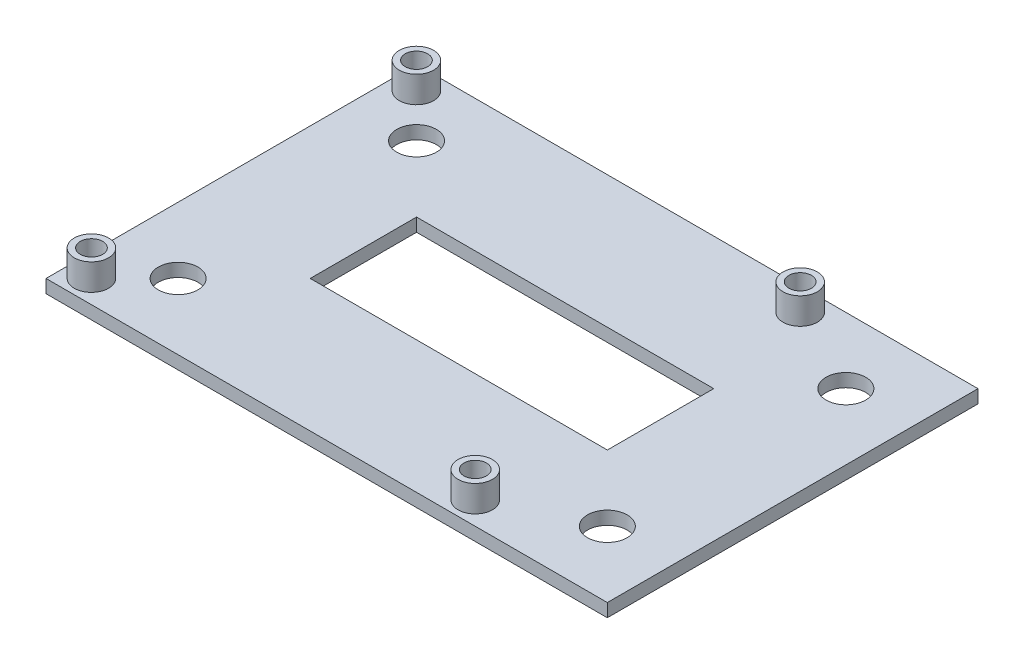
ISO-10303-21;
HEADER;
FILE_DESCRIPTION(('STEP AP214'),'2;1');
FILE_NAME('part.step','',(''),(''),'','','');
FILE_SCHEMA(('AUTOMOTIVE_DESIGN { 1 0 10303 214 1 1 1 1 }'));
ENDSEC;
DATA;
#1=APPLICATION_CONTEXT('core data for automotive mechanical design processes');
#2=APPLICATION_PROTOCOL_DEFINITION('international standard','automotive_design',2000,#1);
#3=PRODUCT_CONTEXT('',#1,'mechanical');
#4=PRODUCT('Part','Part','',(#3));
#5=PRODUCT_RELATED_PRODUCT_CATEGORY('part','',(#4));
#6=PRODUCT_DEFINITION_FORMATION('','',#4);
#7=PRODUCT_DEFINITION_CONTEXT('part definition',#1,'design');
#8=PRODUCT_DEFINITION('design','',#6,#7);
#9=PRODUCT_DEFINITION_SHAPE('','',#8);
#10=(LENGTH_UNIT() NAMED_UNIT(*) SI_UNIT(.MILLI.,.METRE.));
#11=(NAMED_UNIT(*) PLANE_ANGLE_UNIT() SI_UNIT($,.RADIAN.));
#12=(NAMED_UNIT(*) SI_UNIT($,.STERADIAN.) SOLID_ANGLE_UNIT());
#13=UNCERTAINTY_MEASURE_WITH_UNIT(LENGTH_MEASURE(1.E-05),#10,'distance_accuracy_value','');
#14=(GEOMETRIC_REPRESENTATION_CONTEXT(3) GLOBAL_UNCERTAINTY_ASSIGNED_CONTEXT((#13)) GLOBAL_UNIT_ASSIGNED_CONTEXT((#10,
#11,#12)) REPRESENTATION_CONTEXT('',''));
#15=CARTESIAN_POINT('',(0.,0.,0.));
#16=DIRECTION('',(0.,0.,1.));
#17=DIRECTION('',(1.,0.,0.));
#18=AXIS2_PLACEMENT_3D('',#15,#16,#17);
#19=CARTESIAN_POINT('',(0.,2.,0.));
#20=DIRECTION('',(0.,1.,0.));
#21=DIRECTION('',(0.,0.,1.));
#22=AXIS2_PLACEMENT_3D('',#19,#20,#21);
#23=PLANE('',#22);
#24=CARTESIAN_POINT('',(47.6596560099016,2.,28.9234549589851));
#25=DIRECTION('',(0.,1.,0.));
#26=DIRECTION('',(0.,0.,1.));
#27=AXIS2_PLACEMENT_3D('',#24,#25,#26);
#28=CIRCLE('',#27,2.6);
#29=CARTESIAN_POINT('',(47.6596560099016,2.,31.5234549589851));
#30=VERTEX_POINT('',#29);
#31=EDGE_CURVE('E308',#30,#30,#28,.T.);
#32=ORIENTED_EDGE('',*,*,#31,.F.);
#33=EDGE_LOOP('',(#32));
#34=FACE_BOUND('',#33,.T.);
#35=CARTESIAN_POINT('',(-10.4403439900984,2.,28.9234549589851));
#36=DIRECTION('',(0.,1.,0.));
#37=DIRECTION('',(0.,0.,1.));
#38=AXIS2_PLACEMENT_3D('',#35,#36,#37);
#39=CIRCLE('',#38,2.6);
#40=CARTESIAN_POINT('',(-10.4403439900984,2.,31.5234549589851));
#41=VERTEX_POINT('',#40);
#42=EDGE_CURVE('E314',#41,#41,#39,.T.);
#43=ORIENTED_EDGE('',*,*,#42,.F.);
#44=EDGE_LOOP('',(#43));
#45=FACE_BOUND('',#44,.T.);
#46=CARTESIAN_POINT('',(47.6596560099016,2.,-20.2765450410149));
#47=DIRECTION('',(0.,1.,0.));
#48=DIRECTION('',(0.,0.,1.));
#49=AXIS2_PLACEMENT_3D('',#46,#47,#48);
#50=CIRCLE('',#49,2.6);
#51=CARTESIAN_POINT('',(47.6596560099016,2.,-17.6765450410149));
#52=VERTEX_POINT('',#51);
#53=EDGE_CURVE('E320',#52,#52,#50,.T.);
#54=ORIENTED_EDGE('',*,*,#53,.F.);
#55=EDGE_LOOP('',(#54));
#56=FACE_BOUND('',#55,.T.);
#57=CARTESIAN_POINT('',(-10.4403439900984,2.,-20.2765450410149));
#58=DIRECTION('',(0.,1.,0.));
#59=DIRECTION('',(0.,0.,1.));
#60=AXIS2_PLACEMENT_3D('',#57,#58,#59);
#61=CIRCLE('',#60,2.6);
#62=CARTESIAN_POINT('',(-10.4403439900984,2.,-17.6765450410149));
#63=VERTEX_POINT('',#62);
#64=EDGE_CURVE('E326',#63,#63,#61,.T.);
#65=ORIENTED_EDGE('',*,*,#64,.F.);
#66=EDGE_LOOP('',(#65));
#67=FACE_BOUND('',#66,.T.);
#68=CARTESIAN_POINT('',(61.1246485529559,2.,-13.7265450410149));
#69=DIRECTION('',(0.,1.,0.));
#70=DIRECTION('',(0.,0.,1.));
#71=AXIS2_PLACEMENT_3D('',#68,#69,#70);
#72=CIRCLE('',#71,3.);
#73=CARTESIAN_POINT('',(61.1246485529559,2.,-10.7265450410149));
#74=VERTEX_POINT('',#73);
#75=EDGE_CURVE('E341',#74,#74,#72,.T.);
#76=ORIENTED_EDGE('',*,*,#75,.F.);
#77=EDGE_LOOP('',(#76));
#78=FACE_BOUND('',#77,.T.);
#79=CARTESIAN_POINT('',(-3.87209862491442,2.,-13.7265450410149));
#80=DIRECTION('',(0.,1.,0.));
#81=DIRECTION('',(0.,0.,1.));
#82=AXIS2_PLACEMENT_3D('',#79,#80,#81);
#83=CIRCLE('',#82,3.);
#84=CARTESIAN_POINT('',(-3.87209862491442,2.,-10.7265450410149));
#85=VERTEX_POINT('',#84);
#86=EDGE_CURVE('E127',#85,#85,#83,.T.);
#87=ORIENTED_EDGE('',*,*,#86,.F.);
#88=EDGE_LOOP('',(#87));
#89=FACE_BOUND('',#88,.T.);
#90=DIRECTION('',(1.,0.,0.));
#91=VECTOR('',#90,1.);
#92=CARTESIAN_POINT('',(71.1096560099016,2.,32.3734549589851));
#93=LINE('',#92,#91);
#94=CARTESIAN_POINT('',(-13.8720986249144,2.,32.3734549589851));
#95=VERTEX_POINT('',#94);
#96=CARTESIAN_POINT('',(71.1096560099016,2.,32.3734549589851));
#97=VERTEX_POINT('',#96);
#98=EDGE_CURVE('E137',#95,#97,#93,.T.);
#99=ORIENTED_EDGE('',*,*,#98,.T.);
#100=DIRECTION('',(0.000325229308716985,0.,-0.999999947112947));
#101=VECTOR('',#100,1.);
#102=CARTESIAN_POINT('',(71.1096560099016,2.,32.3734549589851));
#103=LINE('',#102,#101);
#104=CARTESIAN_POINT('',(71.1279013750856,2.,-23.7265450410149));
#105=VERTEX_POINT('',#104);
#106=EDGE_CURVE('E140',#97,#105,#103,.T.);
#107=ORIENTED_EDGE('',*,*,#106,.T.);
#108=DIRECTION('',(-1.,0.,0.));
#109=VECTOR('',#108,1.);
#110=CARTESIAN_POINT('',(-13.8720986249144,2.,-23.7265450410149));
#111=LINE('',#110,#109);
#112=CARTESIAN_POINT('',(-13.8720986249144,2.,-23.7265450410149));
#113=VERTEX_POINT('',#112);
#114=EDGE_CURVE('E143',#105,#113,#111,.T.);
#115=ORIENTED_EDGE('',*,*,#114,.T.);
#116=DIRECTION('',(0.,0.,1.));
#117=VECTOR('',#116,1.);
#118=CARTESIAN_POINT('',(-13.8720986249144,2.,-23.7265450410149));
#119=LINE('',#118,#117);
#120=EDGE_CURVE('E145',#113,#95,#119,.T.);
#121=ORIENTED_EDGE('',*,*,#120,.T.);
#122=EDGE_LOOP('',(#99,#107,#115,#121));
#123=FACE_BOUND('',#122,.T.);
#124=DIRECTION('',(1.,0.,0.));
#125=VECTOR('',#124,1.);
#126=CARTESIAN_POINT('',(51.1161595386789,2.,12.3734549589851));
#127=LINE('',#126,#125);
#128=CARTESIAN_POINT('',(6.12790137508558,2.,12.3734549589851));
#129=VERTEX_POINT('',#128);
#130=CARTESIAN_POINT('',(51.1161595386789,2.,12.3734549589851));
#131=VERTEX_POINT('',#130);
#132=EDGE_CURVE('E106',#129,#131,#127,.T.);
#133=ORIENTED_EDGE('',*,*,#132,.F.);
#134=DIRECTION('',(0.,0.,1.));
#135=VECTOR('',#134,1.);
#136=CARTESIAN_POINT('',(6.12790137508558,2.,-3.72654504101487));
#137=LINE('',#136,#135);
#138=CARTESIAN_POINT('',(6.12790137508558,2.,-3.72654504101487));
#139=VERTEX_POINT('',#138);
#140=EDGE_CURVE('E98',#139,#129,#137,.T.);
#141=ORIENTED_EDGE('',*,*,#140,.F.);
#142=DIRECTION('',(-1.,0.,0.));
#143=VECTOR('',#142,1.);
#144=CARTESIAN_POINT('',(6.12790137508558,2.,-3.72654504101487));
#145=LINE('',#144,#143);
#146=CARTESIAN_POINT('',(51.1213957308261,2.,-3.72654504101487));
#147=VERTEX_POINT('',#146);
#148=EDGE_CURVE('E121',#147,#139,#145,.T.);
#149=ORIENTED_EDGE('',*,*,#148,.F.);
#150=DIRECTION('',(0.000325229308716912,0.,-0.999999947112947));
#151=VECTOR('',#150,1.);
#152=CARTESIAN_POINT('',(51.1161595386789,2.,12.3734549589851));
#153=LINE('',#152,#151);
#154=EDGE_CURVE('E119',#131,#147,#153,.T.);
#155=ORIENTED_EDGE('',*,*,#154,.F.);
#156=EDGE_LOOP('',(#133,#141,#149,#155));
#157=FACE_BOUND('',#156,.T.);
#158=CARTESIAN_POINT('',(-3.87209862491442,2.,22.3734549589851));
#159=DIRECTION('',(0.,1.,0.));
#160=DIRECTION('',(0.,0.,1.));
#161=AXIS2_PLACEMENT_3D('',#158,#159,#160);
#162=CIRCLE('',#161,3.);
#163=CARTESIAN_POINT('',(-3.87209862491442,2.,25.3734549589851));
#164=VERTEX_POINT('',#163);
#165=EDGE_CURVE('E347',#164,#164,#162,.T.);
#166=ORIENTED_EDGE('',*,*,#165,.F.);
#167=EDGE_LOOP('',(#166));
#168=FACE_BOUND('',#167,.T.);
#169=CARTESIAN_POINT('',(61.1129077742902,2.,22.3734549589851));
#170=DIRECTION('',(0.,1.,0.));
#171=DIRECTION('',(0.,0.,1.));
#172=AXIS2_PLACEMENT_3D('',#169,#170,#171);
#173=CIRCLE('',#172,3.);
#174=CARTESIAN_POINT('',(61.1129077742902,2.,25.3734549589851));
#175=VERTEX_POINT('',#174);
#176=EDGE_CURVE('E335',#175,#175,#173,.T.);
#177=ORIENTED_EDGE('',*,*,#176,.F.);
#178=EDGE_LOOP('',(#177));
#179=FACE_BOUND('',#178,.T.);
#180=ADVANCED_FACE('F33',(#34,#45,#56,#67,#78,#89,#123,#157,#168,#179),#23,.T.);
#181=CARTESIAN_POINT('',(0.,0.,0.));
#182=DIRECTION('',(0.,1.,0.));
#183=DIRECTION('',(0.,0.,1.));
#184=AXIS2_PLACEMENT_3D('',#181,#182,#183);
#185=PLANE('',#184);
#186=CARTESIAN_POINT('',(47.6596560099016,0.,28.9234549589851));
#187=DIRECTION('',(0.,1.,0.));
#188=DIRECTION('',(0.,0.,1.));
#189=AXIS2_PLACEMENT_3D('',#186,#187,#188);
#190=CIRCLE('',#189,1.7);
#191=CARTESIAN_POINT('',(47.6596560099016,0.,30.6234549589851));
#192=VERTEX_POINT('',#191);
#193=EDGE_CURVE('E285',#192,#192,#190,.T.);
#194=ORIENTED_EDGE('',*,*,#193,.T.);
#195=EDGE_LOOP('',(#194));
#196=FACE_BOUND('',#195,.T.);
#197=CARTESIAN_POINT('',(47.6596560099016,0.,-20.2765450410149));
#198=DIRECTION('',(0.,1.,0.));
#199=DIRECTION('',(0.,0.,1.));
#200=AXIS2_PLACEMENT_3D('',#197,#198,#199);
#201=CIRCLE('',#200,1.7);
#202=CARTESIAN_POINT('',(47.6596560099016,0.,-18.5765450410149));
#203=VERTEX_POINT('',#202);
#204=EDGE_CURVE('E293',#203,#203,#201,.T.);
#205=ORIENTED_EDGE('',*,*,#204,.T.);
#206=EDGE_LOOP('',(#205));
#207=FACE_BOUND('',#206,.T.);
#208=CARTESIAN_POINT('',(-10.4403439900984,0.,-20.2765450410149));
#209=DIRECTION('',(0.,1.,0.));
#210=DIRECTION('',(0.,0.,1.));
#211=AXIS2_PLACEMENT_3D('',#208,#209,#210);
#212=CIRCLE('',#211,1.7);
#213=CARTESIAN_POINT('',(-10.4403439900984,0.,-18.5765450410149));
#214=VERTEX_POINT('',#213);
#215=EDGE_CURVE('E299',#214,#214,#212,.T.);
#216=ORIENTED_EDGE('',*,*,#215,.T.);
#217=EDGE_LOOP('',(#216));
#218=FACE_BOUND('',#217,.T.);
#219=CARTESIAN_POINT('',(-10.4403439900984,0.,28.9234549589851));
#220=DIRECTION('',(0.,1.,0.));
#221=DIRECTION('',(0.,0.,1.));
#222=AXIS2_PLACEMENT_3D('',#219,#220,#221);
#223=CIRCLE('',#222,1.7);
#224=CARTESIAN_POINT('',(-10.4403439900984,0.,30.6234549589851));
#225=VERTEX_POINT('',#224);
#226=EDGE_CURVE('E305',#225,#225,#223,.T.);
#227=ORIENTED_EDGE('',*,*,#226,.T.);
#228=EDGE_LOOP('',(#227));
#229=FACE_BOUND('',#228,.T.);
#230=CARTESIAN_POINT('',(61.1246485529559,0.,-13.7265450410149));
#231=DIRECTION('',(0.,1.,0.));
#232=DIRECTION('',(0.,0.,1.));
#233=AXIS2_PLACEMENT_3D('',#230,#231,#232);
#234=CIRCLE('',#233,3.);
#235=CARTESIAN_POINT('',(61.1246485529559,0.,-10.7265450410149));
#236=VERTEX_POINT('',#235);
#237=EDGE_CURVE('E338',#236,#236,#234,.T.);
#238=ORIENTED_EDGE('',*,*,#237,.T.);
#239=EDGE_LOOP('',(#238));
#240=FACE_BOUND('',#239,.T.);
#241=CARTESIAN_POINT('',(-3.87209862491442,0.,-13.7265450410149));
#242=DIRECTION('',(0.,1.,0.));
#243=DIRECTION('',(0.,0.,1.));
#244=AXIS2_PLACEMENT_3D('',#241,#242,#243);
#245=CIRCLE('',#244,3.);
#246=CARTESIAN_POINT('',(-3.87209862491442,0.,-10.7265450410149));
#247=VERTEX_POINT('',#246);
#248=EDGE_CURVE('E350',#247,#247,#245,.T.);
#249=ORIENTED_EDGE('',*,*,#248,.T.);
#250=EDGE_LOOP('',(#249));
#251=FACE_BOUND('',#250,.T.);
#252=DIRECTION('',(1.,0.,0.));
#253=VECTOR('',#252,1.);
#254=CARTESIAN_POINT('',(71.1096560099016,0.,32.3734549589851));
#255=LINE('',#254,#253);
#256=CARTESIAN_POINT('',(-13.8720986249144,0.,32.3734549589851));
#257=VERTEX_POINT('',#256);
#258=CARTESIAN_POINT('',(71.1096560099016,0.,32.3734549589851));
#259=VERTEX_POINT('',#258);
#260=EDGE_CURVE('E114',#257,#259,#255,.T.);
#261=ORIENTED_EDGE('',*,*,#260,.F.);
#262=DIRECTION('',(0.,0.,1.));
#263=VECTOR('',#262,1.);
#264=CARTESIAN_POINT('',(-13.8720986249144,0.,-23.7265450410149));
#265=LINE('',#264,#263);
#266=CARTESIAN_POINT('',(-13.8720986249144,0.,-23.7265450410149));
#267=VERTEX_POINT('',#266);
#268=EDGE_CURVE('E141',#267,#257,#265,.T.);
#269=ORIENTED_EDGE('',*,*,#268,.F.);
#270=DIRECTION('',(-1.,0.,0.));
#271=VECTOR('',#270,1.);
#272=CARTESIAN_POINT('',(-13.8720986249144,0.,-23.7265450410149));
#273=LINE('',#272,#271);
#274=CARTESIAN_POINT('',(71.1279013750856,0.,-23.7265450410149));
#275=VERTEX_POINT('',#274);
#276=EDGE_CURVE('E152',#275,#267,#273,.T.);
#277=ORIENTED_EDGE('',*,*,#276,.F.);
#278=DIRECTION('',(0.000325229308716985,0.,-0.999999947112947));
#279=VECTOR('',#278,1.);
#280=CARTESIAN_POINT('',(71.1096560099016,0.,32.3734549589851));
#281=LINE('',#280,#279);
#282=EDGE_CURVE('E150',#259,#275,#281,.T.);
#283=ORIENTED_EDGE('',*,*,#282,.F.);
#284=EDGE_LOOP('',(#261,#269,#277,#283));
#285=FACE_BOUND('',#284,.T.);
#286=DIRECTION('',(0.,0.,1.));
#287=VECTOR('',#286,1.);
#288=CARTESIAN_POINT('',(6.12790137508558,0.,-3.72654504101487));
#289=LINE('',#288,#287);
#290=CARTESIAN_POINT('',(6.12790137508558,0.,-3.72654504101487));
#291=VERTEX_POINT('',#290);
#292=CARTESIAN_POINT('',(6.12790137508558,0.,12.3734549589851));
#293=VERTEX_POINT('',#292);
#294=EDGE_CURVE('E56',#291,#293,#289,.T.);
#295=ORIENTED_EDGE('',*,*,#294,.T.);
#296=DIRECTION('',(1.,0.,0.));
#297=VECTOR('',#296,1.);
#298=CARTESIAN_POINT('',(51.1161595386789,0.,12.3734549589851));
#299=LINE('',#298,#297);
#300=CARTESIAN_POINT('',(51.1161595386789,0.,12.3734549589851));
#301=VERTEX_POINT('',#300);
#302=EDGE_CURVE('E113',#293,#301,#299,.T.);
#303=ORIENTED_EDGE('',*,*,#302,.T.);
#304=DIRECTION('',(0.000325229308716912,0.,-0.999999947112947));
#305=VECTOR('',#304,1.);
#306=CARTESIAN_POINT('',(51.1161595386789,0.,12.3734549589851));
#307=LINE('',#306,#305);
#308=CARTESIAN_POINT('',(51.1213957308261,0.,-3.72654504101487));
#309=VERTEX_POINT('',#308);
#310=EDGE_CURVE('E129',#301,#309,#307,.T.);
#311=ORIENTED_EDGE('',*,*,#310,.T.);
#312=DIRECTION('',(-1.,0.,0.));
#313=VECTOR('',#312,1.);
#314=CARTESIAN_POINT('',(6.12790137508558,0.,-3.72654504101487));
#315=LINE('',#314,#313);
#316=EDGE_CURVE('E107',#309,#291,#315,.T.);
#317=ORIENTED_EDGE('',*,*,#316,.T.);
#318=EDGE_LOOP('',(#295,#303,#311,#317));
#319=FACE_BOUND('',#318,.T.);
#320=CARTESIAN_POINT('',(-3.87209862491442,0.,22.3734549589851));
#321=DIRECTION('',(0.,1.,0.));
#322=DIRECTION('',(0.,0.,1.));
#323=AXIS2_PLACEMENT_3D('',#320,#321,#322);
#324=CIRCLE('',#323,3.);
#325=CARTESIAN_POINT('',(-3.87209862491442,0.,25.3734549589851));
#326=VERTEX_POINT('',#325);
#327=EDGE_CURVE('E344',#326,#326,#324,.T.);
#328=ORIENTED_EDGE('',*,*,#327,.T.);
#329=EDGE_LOOP('',(#328));
#330=FACE_BOUND('',#329,.T.);
#331=CARTESIAN_POINT('',(61.1129077742902,0.,22.3734549589851));
#332=DIRECTION('',(0.,1.,0.));
#333=DIRECTION('',(0.,0.,1.));
#334=AXIS2_PLACEMENT_3D('',#331,#332,#333);
#335=CIRCLE('',#334,3.);
#336=CARTESIAN_POINT('',(61.1129077742902,0.,25.3734549589851));
#337=VERTEX_POINT('',#336);
#338=EDGE_CURVE('E332',#337,#337,#335,.T.);
#339=ORIENTED_EDGE('',*,*,#338,.T.);
#340=EDGE_LOOP('',(#339));
#341=FACE_BOUND('',#340,.T.);
#342=ADVANCED_FACE('F170',(#196,#207,#218,#229,#240,#251,#285,#319,#330,#341),#185,.F.);
#343=CARTESIAN_POINT('',(71.1096560099016,2.,32.3734549589851));
#344=DIRECTION('',(0.,0.,-1.));
#345=DIRECTION('',(-1.,0.,0.));
#346=AXIS2_PLACEMENT_3D('',#343,#344,#345);
#347=PLANE('',#346);
#348=ORIENTED_EDGE('',*,*,#260,.T.);
#349=DIRECTION('',(0.,-1.,0.));
#350=VECTOR('',#349,1.);
#351=CARTESIAN_POINT('',(71.1096560099016,2.,32.3734549589851));
#352=LINE('',#351,#350);
#353=EDGE_CURVE('E11',#97,#259,#352,.T.);
#354=ORIENTED_EDGE('',*,*,#353,.F.);
#355=ORIENTED_EDGE('',*,*,#98,.F.);
#356=DIRECTION('',(0.,-1.,0.));
#357=VECTOR('',#356,1.);
#358=CARTESIAN_POINT('',(-13.8720986249144,2.,32.3734549589851));
#359=LINE('',#358,#357);
#360=EDGE_CURVE('E147',#95,#257,#359,.T.);
#361=ORIENTED_EDGE('',*,*,#360,.T.);
#362=EDGE_LOOP('',(#348,#354,#355,#361));
#363=FACE_BOUND('',#362,.T.);
#364=ADVANCED_FACE('F35',(#363),#347,.F.);
#365=CARTESIAN_POINT('',(71.1096560099016,2.,32.3734549589851));
#366=DIRECTION('',(-0.999999947112947,0.,-0.000325229308716985));
#367=DIRECTION('',(-0.000325229308716985,0.,0.999999947112947));
#368=AXIS2_PLACEMENT_3D('',#365,#366,#367);
#369=PLANE('',#368);
#370=ORIENTED_EDGE('',*,*,#282,.T.);
#371=DIRECTION('',(0.,-1.,0.));
#372=VECTOR('',#371,1.);
#373=CARTESIAN_POINT('',(71.1279013750856,2.,-23.7265450410149));
#374=LINE('',#373,#372);
#375=EDGE_CURVE('E41',#105,#275,#374,.T.);
#376=ORIENTED_EDGE('',*,*,#375,.F.);
#377=ORIENTED_EDGE('',*,*,#106,.F.);
#378=ORIENTED_EDGE('',*,*,#353,.T.);
#379=EDGE_LOOP('',(#370,#376,#377,#378));
#380=FACE_BOUND('',#379,.T.);
#381=ADVANCED_FACE('F180',(#380),#369,.F.);
#382=CARTESIAN_POINT('',(-13.8720986249144,2.,-23.7265450410149));
#383=DIRECTION('',(0.,0.,1.));
#384=DIRECTION('',(1.,0.,0.));
#385=AXIS2_PLACEMENT_3D('',#382,#383,#384);
#386=PLANE('',#385);
#387=ORIENTED_EDGE('',*,*,#276,.T.);
#388=DIRECTION('',(0.,-1.,0.));
#389=VECTOR('',#388,1.);
#390=CARTESIAN_POINT('',(-13.8720986249144,2.,-23.7265450410149));
#391=LINE('',#390,#389);
#392=EDGE_CURVE('E157',#113,#267,#391,.T.);
#393=ORIENTED_EDGE('',*,*,#392,.F.);
#394=ORIENTED_EDGE('',*,*,#114,.F.);
#395=ORIENTED_EDGE('',*,*,#375,.T.);
#396=EDGE_LOOP('',(#387,#393,#394,#395));
#397=FACE_BOUND('',#396,.T.);
#398=ADVANCED_FACE('F164',(#397),#386,.F.);
#399=CARTESIAN_POINT('',(-13.8720986249144,2.,-23.7265450410149));
#400=DIRECTION('',(1.,0.,0.));
#401=DIRECTION('',(0.,0.,-1.));
#402=AXIS2_PLACEMENT_3D('',#399,#400,#401);
#403=PLANE('',#402);
#404=ORIENTED_EDGE('',*,*,#268,.T.);
#405=ORIENTED_EDGE('',*,*,#360,.F.);
#406=ORIENTED_EDGE('',*,*,#120,.F.);
#407=ORIENTED_EDGE('',*,*,#392,.T.);
#408=EDGE_LOOP('',(#404,#405,#406,#407));
#409=FACE_BOUND('',#408,.T.);
#410=ADVANCED_FACE('F174',(#409),#403,.F.);
#411=CARTESIAN_POINT('',(6.12790137508558,2.,-3.72654504101487));
#412=DIRECTION('',(1.,0.,0.));
#413=DIRECTION('',(0.,0.,-1.));
#414=AXIS2_PLACEMENT_3D('',#411,#412,#413);
#415=PLANE('',#414);
#416=ORIENTED_EDGE('',*,*,#294,.F.);
#417=DIRECTION('',(0.,-1.,0.));
#418=VECTOR('',#417,1.);
#419=CARTESIAN_POINT('',(6.12790137508558,2.,-3.72654504101487));
#420=LINE('',#419,#418);
#421=EDGE_CURVE('E102',#139,#291,#420,.T.);
#422=ORIENTED_EDGE('',*,*,#421,.F.);
#423=ORIENTED_EDGE('',*,*,#140,.T.);
#424=DIRECTION('',(0.,-1.,0.));
#425=VECTOR('',#424,1.);
#426=CARTESIAN_POINT('',(6.12790137508558,2.,12.3734549589851));
#427=LINE('',#426,#425);
#428=EDGE_CURVE('E101',#129,#293,#427,.T.);
#429=ORIENTED_EDGE('',*,*,#428,.T.);
#430=EDGE_LOOP('',(#416,#422,#423,#429));
#431=FACE_BOUND('',#430,.T.);
#432=ADVANCED_FACE('F100',(#431),#415,.T.);
#433=CARTESIAN_POINT('',(51.1161595386789,2.,12.3734549589851));
#434=DIRECTION('',(0.,0.,-1.));
#435=DIRECTION('',(-1.,0.,0.));
#436=AXIS2_PLACEMENT_3D('',#433,#434,#435);
#437=PLANE('',#436);
#438=ORIENTED_EDGE('',*,*,#302,.F.);
#439=ORIENTED_EDGE('',*,*,#428,.F.);
#440=ORIENTED_EDGE('',*,*,#132,.T.);
#441=DIRECTION('',(0.,-1.,0.));
#442=VECTOR('',#441,1.);
#443=CARTESIAN_POINT('',(51.1161595386789,2.,12.3734549589851));
#444=LINE('',#443,#442);
#445=EDGE_CURVE('E115',#131,#301,#444,.T.);
#446=ORIENTED_EDGE('',*,*,#445,.T.);
#447=EDGE_LOOP('',(#438,#439,#440,#446));
#448=FACE_BOUND('',#447,.T.);
#449=ADVANCED_FACE('F110',(#448),#437,.T.);
#450=CARTESIAN_POINT('',(51.1161595386789,2.,12.3734549589851));
#451=DIRECTION('',(-0.999999947112947,0.,-0.000325229308716912));
#452=DIRECTION('',(-0.000325229308716912,0.,0.999999947112947));
#453=AXIS2_PLACEMENT_3D('',#450,#451,#452);
#454=PLANE('',#453);
#455=ORIENTED_EDGE('',*,*,#310,.F.);
#456=ORIENTED_EDGE('',*,*,#445,.F.);
#457=ORIENTED_EDGE('',*,*,#154,.T.);
#458=DIRECTION('',(0.,-1.,0.));
#459=VECTOR('',#458,1.);
#460=CARTESIAN_POINT('',(51.1213957308261,2.,-3.72654504101487));
#461=LINE('',#460,#459);
#462=EDGE_CURVE('E48',#147,#309,#461,.T.);
#463=ORIENTED_EDGE('',*,*,#462,.T.);
#464=EDGE_LOOP('',(#455,#456,#457,#463));
#465=FACE_BOUND('',#464,.T.);
#466=ADVANCED_FACE('F207',(#465),#454,.T.);
#467=CARTESIAN_POINT('',(6.12790137508558,2.,-3.72654504101487));
#468=DIRECTION('',(0.,0.,1.));
#469=DIRECTION('',(1.,0.,0.));
#470=AXIS2_PLACEMENT_3D('',#467,#468,#469);
#471=PLANE('',#470);
#472=ORIENTED_EDGE('',*,*,#316,.F.);
#473=ORIENTED_EDGE('',*,*,#462,.F.);
#474=ORIENTED_EDGE('',*,*,#148,.T.);
#475=ORIENTED_EDGE('',*,*,#421,.T.);
#476=EDGE_LOOP('',(#472,#473,#474,#475));
#477=FACE_BOUND('',#476,.T.);
#478=ADVANCED_FACE('F211',(#477),#471,.T.);
#479=CARTESIAN_POINT('',(-3.87209862491442,2.,-13.7265450410149));
#480=DIRECTION('',(0.,-1.,0.));
#481=DIRECTION('',(0.,0.,-1.));
#482=AXIS2_PLACEMENT_3D('',#479,#480,#481);
#483=CYLINDRICAL_SURFACE('',#482,3.);
#484=ORIENTED_EDGE('',*,*,#86,.T.);
#485=EDGE_LOOP('',(#484));
#486=FACE_BOUND('',#485,.T.);
#487=ORIENTED_EDGE('',*,*,#248,.F.);
#488=EDGE_LOOP('',(#487));
#489=FACE_BOUND('',#488,.T.);
#490=ADVANCED_FACE('F217',(#486,#489),#483,.F.);
#491=CARTESIAN_POINT('',(-3.87209862491442,2.,22.3734549589851));
#492=DIRECTION('',(0.,-1.,0.));
#493=DIRECTION('',(0.,0.,-1.));
#494=AXIS2_PLACEMENT_3D('',#491,#492,#493);
#495=CYLINDRICAL_SURFACE('',#494,3.);
#496=ORIENTED_EDGE('',*,*,#165,.T.);
#497=EDGE_LOOP('',(#496));
#498=FACE_BOUND('',#497,.T.);
#499=ORIENTED_EDGE('',*,*,#327,.F.);
#500=EDGE_LOOP('',(#499));
#501=FACE_BOUND('',#500,.T.);
#502=ADVANCED_FACE('F220',(#498,#501),#495,.F.);
#503=CARTESIAN_POINT('',(61.1246485529559,2.,-13.7265450410149));
#504=DIRECTION('',(0.,-1.,0.));
#505=DIRECTION('',(0.,0.,-1.));
#506=AXIS2_PLACEMENT_3D('',#503,#504,#505);
#507=CYLINDRICAL_SURFACE('',#506,3.);
#508=ORIENTED_EDGE('',*,*,#75,.T.);
#509=EDGE_LOOP('',(#508));
#510=FACE_BOUND('',#509,.T.);
#511=ORIENTED_EDGE('',*,*,#237,.F.);
#512=EDGE_LOOP('',(#511));
#513=FACE_BOUND('',#512,.T.);
#514=ADVANCED_FACE('F224',(#510,#513),#507,.F.);
#515=CARTESIAN_POINT('',(61.1129077742902,2.,22.3734549589851));
#516=DIRECTION('',(0.,-1.,0.));
#517=DIRECTION('',(0.,0.,-1.));
#518=AXIS2_PLACEMENT_3D('',#515,#516,#517);
#519=CYLINDRICAL_SURFACE('',#518,3.);
#520=ORIENTED_EDGE('',*,*,#176,.T.);
#521=EDGE_LOOP('',(#520));
#522=FACE_BOUND('',#521,.T.);
#523=ORIENTED_EDGE('',*,*,#338,.F.);
#524=EDGE_LOOP('',(#523));
#525=FACE_BOUND('',#524,.T.);
#526=ADVANCED_FACE('F228',(#522,#525),#519,.F.);
#527=CARTESIAN_POINT('',(-10.4403439900984,6.,-20.2765450410149));
#528=DIRECTION('',(0.,-1.,0.));
#529=DIRECTION('',(0.,0.,-1.));
#530=AXIS2_PLACEMENT_3D('',#527,#528,#529);
#531=CYLINDRICAL_SURFACE('',#530,2.6);
#532=CARTESIAN_POINT('',(-10.4403439900984,6.,-20.2765450410149));
#533=DIRECTION('',(0.,1.,0.));
#534=DIRECTION('',(0.,0.,1.));
#535=AXIS2_PLACEMENT_3D('',#532,#533,#534);
#536=CIRCLE('',#535,2.6);
#537=CARTESIAN_POINT('',(-10.4403439900984,6.,-17.6765450410149));
#538=VERTEX_POINT('',#537);
#539=EDGE_CURVE('E329',#538,#538,#536,.T.);
#540=ORIENTED_EDGE('',*,*,#539,.F.);
#541=EDGE_LOOP('',(#540));
#542=FACE_BOUND('',#541,.T.);
#543=ORIENTED_EDGE('',*,*,#64,.T.);
#544=EDGE_LOOP('',(#543));
#545=FACE_BOUND('',#544,.T.);
#546=ADVANCED_FACE('F232',(#542,#545),#531,.T.);
#547=CARTESIAN_POINT('',(-10.4403439900984,6.,-20.2765450410149));
#548=DIRECTION('',(0.,1.,0.));
#549=DIRECTION('',(0.,0.,1.));
#550=AXIS2_PLACEMENT_3D('',#547,#548,#549);
#551=PLANE('',#550);
#552=CARTESIAN_POINT('',(-10.4403439900984,6.,-20.2765450410149));
#553=DIRECTION('',(0.,1.,0.));
#554=DIRECTION('',(0.,0.,1.));
#555=AXIS2_PLACEMENT_3D('',#552,#553,#554);
#556=CIRCLE('',#555,1.7);
#557=CARTESIAN_POINT('',(-10.4403439900984,6.,-18.5765450410149));
#558=VERTEX_POINT('',#557);
#559=EDGE_CURVE('E296',#558,#558,#556,.T.);
#560=ORIENTED_EDGE('',*,*,#559,.F.);
#561=EDGE_LOOP('',(#560));
#562=FACE_BOUND('',#561,.T.);
#563=ORIENTED_EDGE('',*,*,#539,.T.);
#564=EDGE_LOOP('',(#563));
#565=FACE_BOUND('',#564,.T.);
#566=ADVANCED_FACE('F236',(#562,#565),#551,.T.);
#567=CARTESIAN_POINT('',(47.6596560099016,6.,-20.2765450410149));
#568=DIRECTION('',(0.,-1.,0.));
#569=DIRECTION('',(0.,0.,-1.));
#570=AXIS2_PLACEMENT_3D('',#567,#568,#569);
#571=CYLINDRICAL_SURFACE('',#570,2.6);
#572=CARTESIAN_POINT('',(47.6596560099016,6.,-20.2765450410149));
#573=DIRECTION('',(0.,1.,0.));
#574=DIRECTION('',(0.,0.,1.));
#575=AXIS2_PLACEMENT_3D('',#572,#573,#574);
#576=CIRCLE('',#575,2.6);
#577=CARTESIAN_POINT('',(47.6596560099016,6.,-17.6765450410149));
#578=VERTEX_POINT('',#577);
#579=EDGE_CURVE('E323',#578,#578,#576,.T.);
#580=ORIENTED_EDGE('',*,*,#579,.F.);
#581=EDGE_LOOP('',(#580));
#582=FACE_BOUND('',#581,.T.);
#583=ORIENTED_EDGE('',*,*,#53,.T.);
#584=EDGE_LOOP('',(#583));
#585=FACE_BOUND('',#584,.T.);
#586=ADVANCED_FACE('F240',(#582,#585),#571,.T.);
#587=CARTESIAN_POINT('',(47.6596560099016,6.,-20.2765450410149));
#588=DIRECTION('',(0.,1.,0.));
#589=DIRECTION('',(0.,0.,1.));
#590=AXIS2_PLACEMENT_3D('',#587,#588,#589);
#591=PLANE('',#590);
#592=CARTESIAN_POINT('',(47.6596560099016,6.,-20.2765450410149));
#593=DIRECTION('',(0.,1.,0.));
#594=DIRECTION('',(0.,0.,1.));
#595=AXIS2_PLACEMENT_3D('',#592,#593,#594);
#596=CIRCLE('',#595,1.7);
#597=CARTESIAN_POINT('',(47.6596560099016,6.,-18.5765450410149));
#598=VERTEX_POINT('',#597);
#599=EDGE_CURVE('E290',#598,#598,#596,.T.);
#600=ORIENTED_EDGE('',*,*,#599,.F.);
#601=EDGE_LOOP('',(#600));
#602=FACE_BOUND('',#601,.T.);
#603=ORIENTED_EDGE('',*,*,#579,.T.);
#604=EDGE_LOOP('',(#603));
#605=FACE_BOUND('',#604,.T.);
#606=ADVANCED_FACE('F244',(#602,#605),#591,.T.);
#607=CARTESIAN_POINT('',(-10.4403439900984,6.,28.9234549589851));
#608=DIRECTION('',(0.,-1.,0.));
#609=DIRECTION('',(0.,0.,-1.));
#610=AXIS2_PLACEMENT_3D('',#607,#608,#609);
#611=CYLINDRICAL_SURFACE('',#610,2.6);
#612=CARTESIAN_POINT('',(-10.4403439900984,6.,28.9234549589851));
#613=DIRECTION('',(0.,1.,0.));
#614=DIRECTION('',(0.,0.,1.));
#615=AXIS2_PLACEMENT_3D('',#612,#613,#614);
#616=CIRCLE('',#615,2.6);
#617=CARTESIAN_POINT('',(-10.4403439900984,6.,31.5234549589851));
#618=VERTEX_POINT('',#617);
#619=EDGE_CURVE('E317',#618,#618,#616,.T.);
#620=ORIENTED_EDGE('',*,*,#619,.F.);
#621=EDGE_LOOP('',(#620));
#622=FACE_BOUND('',#621,.T.);
#623=ORIENTED_EDGE('',*,*,#42,.T.);
#624=EDGE_LOOP('',(#623));
#625=FACE_BOUND('',#624,.T.);
#626=ADVANCED_FACE('F248',(#622,#625),#611,.T.);
#627=CARTESIAN_POINT('',(-10.4403439900984,6.,28.9234549589851));
#628=DIRECTION('',(0.,1.,0.));
#629=DIRECTION('',(0.,0.,1.));
#630=AXIS2_PLACEMENT_3D('',#627,#628,#629);
#631=PLANE('',#630);
#632=CARTESIAN_POINT('',(-10.4403439900984,6.,28.9234549589851));
#633=DIRECTION('',(0.,1.,0.));
#634=DIRECTION('',(0.,0.,1.));
#635=AXIS2_PLACEMENT_3D('',#632,#633,#634);
#636=CIRCLE('',#635,1.7);
#637=CARTESIAN_POINT('',(-10.4403439900984,6.,30.6234549589851));
#638=VERTEX_POINT('',#637);
#639=EDGE_CURVE('E302',#638,#638,#636,.T.);
#640=ORIENTED_EDGE('',*,*,#639,.F.);
#641=EDGE_LOOP('',(#640));
#642=FACE_BOUND('',#641,.T.);
#643=ORIENTED_EDGE('',*,*,#619,.T.);
#644=EDGE_LOOP('',(#643));
#645=FACE_BOUND('',#644,.T.);
#646=ADVANCED_FACE('F252',(#642,#645),#631,.T.);
#647=CARTESIAN_POINT('',(47.6596560099016,6.,28.9234549589851));
#648=DIRECTION('',(0.,-1.,0.));
#649=DIRECTION('',(0.,0.,-1.));
#650=AXIS2_PLACEMENT_3D('',#647,#648,#649);
#651=CYLINDRICAL_SURFACE('',#650,2.6);
#652=CARTESIAN_POINT('',(47.6596560099016,6.,28.9234549589851));
#653=DIRECTION('',(0.,1.,0.));
#654=DIRECTION('',(0.,0.,1.));
#655=AXIS2_PLACEMENT_3D('',#652,#653,#654);
#656=CIRCLE('',#655,2.6);
#657=CARTESIAN_POINT('',(47.6596560099016,6.,31.5234549589851));
#658=VERTEX_POINT('',#657);
#659=EDGE_CURVE('E311',#658,#658,#656,.T.);
#660=ORIENTED_EDGE('',*,*,#659,.F.);
#661=EDGE_LOOP('',(#660));
#662=FACE_BOUND('',#661,.T.);
#663=ORIENTED_EDGE('',*,*,#31,.T.);
#664=EDGE_LOOP('',(#663));
#665=FACE_BOUND('',#664,.T.);
#666=ADVANCED_FACE('F256',(#662,#665),#651,.T.);
#667=CARTESIAN_POINT('',(47.6596560099016,6.,28.9234549589851));
#668=DIRECTION('',(0.,1.,0.));
#669=DIRECTION('',(0.,0.,1.));
#670=AXIS2_PLACEMENT_3D('',#667,#668,#669);
#671=PLANE('',#670);
#672=CARTESIAN_POINT('',(47.6596560099016,6.,28.9234549589851));
#673=DIRECTION('',(0.,1.,0.));
#674=DIRECTION('',(0.,0.,1.));
#675=AXIS2_PLACEMENT_3D('',#672,#673,#674);
#676=CIRCLE('',#675,1.7);
#677=CARTESIAN_POINT('',(47.6596560099016,6.,30.6234549589851));
#678=VERTEX_POINT('',#677);
#679=EDGE_CURVE('E288',#678,#678,#676,.T.);
#680=ORIENTED_EDGE('',*,*,#679,.F.);
#681=EDGE_LOOP('',(#680));
#682=FACE_BOUND('',#681,.T.);
#683=ORIENTED_EDGE('',*,*,#659,.T.);
#684=EDGE_LOOP('',(#683));
#685=FACE_BOUND('',#684,.T.);
#686=ADVANCED_FACE('F260',(#682,#685),#671,.T.);
#687=CARTESIAN_POINT('',(-10.4403439900984,0.,28.9234549589851));
#688=DIRECTION('',(0.,1.,0.));
#689=DIRECTION('',(0.,0.,1.));
#690=AXIS2_PLACEMENT_3D('',#687,#688,#689);
#691=CYLINDRICAL_SURFACE('',#690,1.7);
#692=ORIENTED_EDGE('',*,*,#226,.F.);
#693=EDGE_LOOP('',(#692));
#694=FACE_BOUND('',#693,.T.);
#695=ORIENTED_EDGE('',*,*,#639,.T.);
#696=EDGE_LOOP('',(#695));
#697=FACE_BOUND('',#696,.T.);
#698=ADVANCED_FACE('F264',(#694,#697),#691,.F.);
#699=CARTESIAN_POINT('',(-10.4403439900984,0.,-20.2765450410149));
#700=DIRECTION('',(0.,1.,0.));
#701=DIRECTION('',(0.,0.,1.));
#702=AXIS2_PLACEMENT_3D('',#699,#700,#701);
#703=CYLINDRICAL_SURFACE('',#702,1.7);
#704=ORIENTED_EDGE('',*,*,#215,.F.);
#705=EDGE_LOOP('',(#704));
#706=FACE_BOUND('',#705,.T.);
#707=ORIENTED_EDGE('',*,*,#559,.T.);
#708=EDGE_LOOP('',(#707));
#709=FACE_BOUND('',#708,.T.);
#710=ADVANCED_FACE('F268',(#706,#709),#703,.F.);
#711=CARTESIAN_POINT('',(47.6596560099016,0.,-20.2765450410149));
#712=DIRECTION('',(0.,1.,0.));
#713=DIRECTION('',(0.,0.,1.));
#714=AXIS2_PLACEMENT_3D('',#711,#712,#713);
#715=CYLINDRICAL_SURFACE('',#714,1.7);
#716=ORIENTED_EDGE('',*,*,#204,.F.);
#717=EDGE_LOOP('',(#716));
#718=FACE_BOUND('',#717,.T.);
#719=ORIENTED_EDGE('',*,*,#599,.T.);
#720=EDGE_LOOP('',(#719));
#721=FACE_BOUND('',#720,.T.);
#722=ADVANCED_FACE('F272',(#718,#721),#715,.F.);
#723=CARTESIAN_POINT('',(47.6596560099016,0.,28.9234549589851));
#724=DIRECTION('',(0.,1.,0.));
#725=DIRECTION('',(0.,0.,1.));
#726=AXIS2_PLACEMENT_3D('',#723,#724,#725);
#727=CYLINDRICAL_SURFACE('',#726,1.7);
#728=ORIENTED_EDGE('',*,*,#193,.F.);
#729=EDGE_LOOP('',(#728));
#730=FACE_BOUND('',#729,.T.);
#731=ORIENTED_EDGE('',*,*,#679,.T.);
#732=EDGE_LOOP('',(#731));
#733=FACE_BOUND('',#732,.T.);
#734=ADVANCED_FACE('F276',(#730,#733),#727,.F.);
#735=CLOSED_SHELL('',(#180,#342,#364,#381,#398,#410,#432,#449,#466,#478,#490,#502,#514,#526,
#546,#566,#586,#606,#626,#646,#666,#686,#698,#710,#722,#734));
#736=MANIFOLD_SOLID_BREP('B2',#735);
#737=ADVANCED_BREP_SHAPE_REPRESENTATION('',(#18,#736),#14);
#738=SHAPE_DEFINITION_REPRESENTATION(#9,#737);
ENDSEC;
END-ISO-10303-21;
